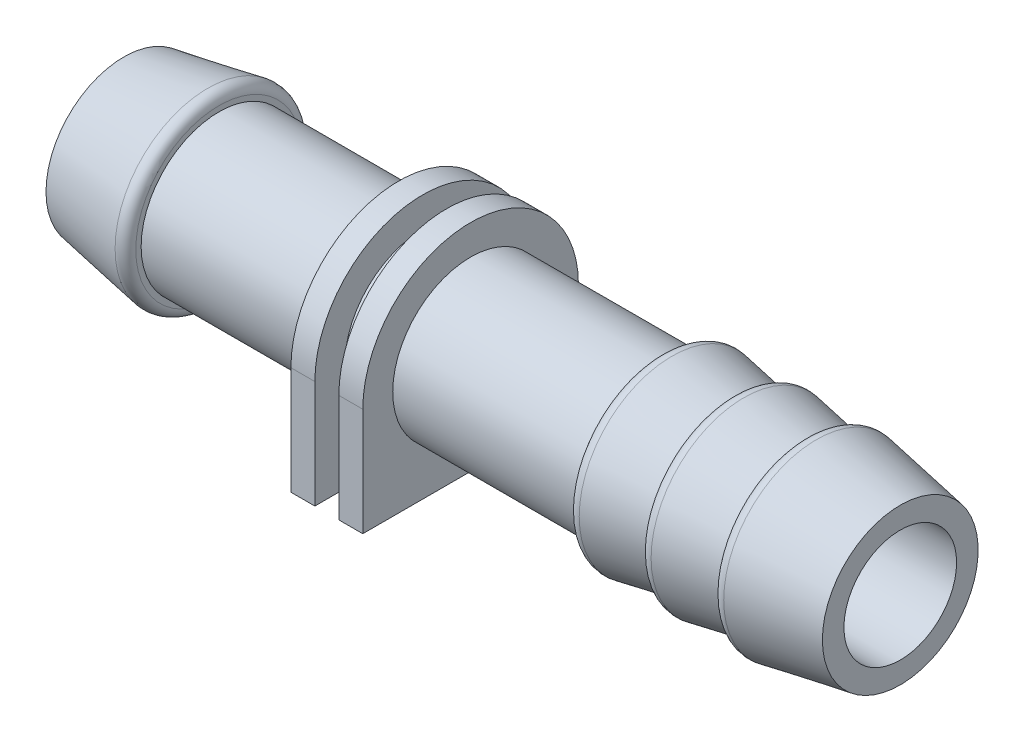
ISO-10303-21;
HEADER;
FILE_DESCRIPTION(('STEP AP214'),'2;1');
FILE_NAME('part.step','',(''),(''),'','','');
FILE_SCHEMA(('AUTOMOTIVE_DESIGN { 1 0 10303 214 1 1 1 1 }'));
ENDSEC;
DATA;
#1=APPLICATION_CONTEXT('core data for automotive mechanical design processes');
#2=APPLICATION_PROTOCOL_DEFINITION('international standard','automotive_design',2000,#1);
#3=PRODUCT_CONTEXT('',#1,'mechanical');
#4=PRODUCT('Part','Part','',(#3));
#5=PRODUCT_RELATED_PRODUCT_CATEGORY('part','',(#4));
#6=PRODUCT_DEFINITION_FORMATION('','',#4);
#7=PRODUCT_DEFINITION_CONTEXT('part definition',#1,'design');
#8=PRODUCT_DEFINITION('design','',#6,#7);
#9=PRODUCT_DEFINITION_SHAPE('','',#8);
#10=(LENGTH_UNIT() NAMED_UNIT(*) SI_UNIT(.MILLI.,.METRE.));
#11=(NAMED_UNIT(*) PLANE_ANGLE_UNIT() SI_UNIT($,.RADIAN.));
#12=(NAMED_UNIT(*) SI_UNIT($,.STERADIAN.) SOLID_ANGLE_UNIT());
#13=UNCERTAINTY_MEASURE_WITH_UNIT(LENGTH_MEASURE(1.E-05),#10,'distance_accuracy_value','');
#14=(GEOMETRIC_REPRESENTATION_CONTEXT(3) GLOBAL_UNCERTAINTY_ASSIGNED_CONTEXT((#13)) GLOBAL_UNIT_ASSIGNED_CONTEXT((#10,
#11,#12)) REPRESENTATION_CONTEXT('',''));
#15=CARTESIAN_POINT('',(0.,0.,0.));
#16=DIRECTION('',(0.,0.,1.));
#17=DIRECTION('',(1.,0.,0.));
#18=AXIS2_PLACEMENT_3D('',#15,#16,#17);
#19=CARTESIAN_POINT('',(9.91718406598036,0.,0.));
#20=DIRECTION('',(-1.,0.,0.));
#21=DIRECTION('',(0.,0.,1.));
#22=AXIS2_PLACEMENT_3D('',#19,#20,#21);
#23=TOROIDAL_SURFACE('',#22,3.47329856296232,0.4);
#24=CARTESIAN_POINT('',(9.98664333704714,0.,0.));
#25=DIRECTION('',(-1.,0.,0.));
#26=DIRECTION('',(0.,0.,1.));
#27=AXIS2_PLACEMENT_3D('',#24,#25,#26);
#28=CIRCLE('',#27,3.8672216641672);
#29=CARTESIAN_POINT('',(9.98664333704714,0.,3.8672216641672));
#30=VERTEX_POINT('',#29);
#31=EDGE_CURVE('E170',#30,#30,#28,.T.);
#32=ORIENTED_EDGE('',*,*,#31,.T.);
#33=EDGE_LOOP('',(#32));
#34=FACE_BOUND('',#33,.T.);
#35=CARTESIAN_POINT('',(9.51718406598036,0.,0.));
#36=DIRECTION('',(-1.,0.,0.));
#37=DIRECTION('',(0.,0.,1.));
#38=AXIS2_PLACEMENT_3D('',#35,#36,#37);
#39=CIRCLE('',#38,3.47329856296232);
#40=CARTESIAN_POINT('',(9.51718406598036,0.,3.47329856296232));
#41=VERTEX_POINT('',#40);
#42=EDGE_CURVE('E209',#41,#41,#39,.T.);
#43=ORIENTED_EDGE('',*,*,#42,.F.);
#44=EDGE_LOOP('',(#43));
#45=FACE_BOUND('',#44,.T.);
#46=ADVANCED_FACE('F32',(#34,#45),#23,.T.);
#47=CARTESIAN_POINT('',(9.51718406598036,0.,3.47329856296232));
#48=DIRECTION('',(-1.,0.,0.));
#49=DIRECTION('',(0.,0.,1.));
#50=AXIS2_PLACEMENT_3D('',#47,#48,#49);
#51=PLANE('',#50);
#52=ORIENTED_EDGE('',*,*,#42,.T.);
#53=EDGE_LOOP('',(#52));
#54=FACE_BOUND('',#53,.T.);
#55=CARTESIAN_POINT('',(9.51718406598036,0.,0.));
#56=DIRECTION('',(-1.,0.,0.));
#57=DIRECTION('',(0.,0.,1.));
#58=AXIS2_PLACEMENT_3D('',#55,#56,#57);
#59=CIRCLE('',#58,3.41571113504077);
#60=CARTESIAN_POINT('',(9.51718406598036,0.,3.41571113504077));
#61=VERTEX_POINT('',#60);
#62=EDGE_CURVE('E206',#61,#61,#59,.T.);
#63=ORIENTED_EDGE('',*,*,#62,.F.);
#64=EDGE_LOOP('',(#63));
#65=FACE_BOUND('',#64,.T.);
#66=ADVANCED_FACE('F248',(#54,#65),#51,.T.);
#67=CARTESIAN_POINT('',(6.9565406107797,0.,0.));
#68=DIRECTION('',(-1.,0.,0.));
#69=DIRECTION('',(0.,0.,1.));
#70=AXIS2_PLACEMENT_3D('',#67,#68,#69);
#71=CONICAL_SURFACE('',#70,3.8672216641672,0.174532925199434);
#72=ORIENTED_EDGE('',*,*,#62,.T.);
#73=EDGE_LOOP('',(#72));
#74=FACE_BOUND('',#73,.T.);
#75=CARTESIAN_POINT('',(6.9565406107797,0.,0.));
#76=DIRECTION('',(-1.,0.,0.));
#77=DIRECTION('',(0.,0.,1.));
#78=AXIS2_PLACEMENT_3D('',#75,#76,#77);
#79=CIRCLE('',#78,3.8672216641672);
#80=CARTESIAN_POINT('',(6.9565406107797,0.,3.8672216641672));
#81=VERTEX_POINT('',#80);
#82=EDGE_CURVE('E203',#81,#81,#79,.T.);
#83=ORIENTED_EDGE('',*,*,#82,.F.);
#84=EDGE_LOOP('',(#83));
#85=FACE_BOUND('',#84,.T.);
#86=ADVANCED_FACE('F253',(#74,#85),#71,.T.);
#87=CARTESIAN_POINT('',(6.88708133971292,0.,0.));
#88=DIRECTION('',(-1.,0.,0.));
#89=DIRECTION('',(0.,0.,1.));
#90=AXIS2_PLACEMENT_3D('',#87,#88,#89);
#91=TOROIDAL_SURFACE('',#90,3.47329856296232,0.4);
#92=ORIENTED_EDGE('',*,*,#82,.T.);
#93=EDGE_LOOP('',(#92));
#94=FACE_BOUND('',#93,.T.);
#95=CARTESIAN_POINT('',(6.48708133971292,0.,0.));
#96=DIRECTION('',(-1.,0.,0.));
#97=DIRECTION('',(0.,0.,1.));
#98=AXIS2_PLACEMENT_3D('',#95,#96,#97);
#99=CIRCLE('',#98,3.47329856296231);
#100=CARTESIAN_POINT('',(6.48708133971292,0.,3.47329856296231));
#101=VERTEX_POINT('',#100);
#102=EDGE_CURVE('E200',#101,#101,#99,.T.);
#103=ORIENTED_EDGE('',*,*,#102,.F.);
#104=EDGE_LOOP('',(#103));
#105=FACE_BOUND('',#104,.T.);
#106=ADVANCED_FACE('F263',(#94,#105),#91,.T.);
#107=CARTESIAN_POINT('',(6.48708133971292,0.,3.47329856296231));
#108=DIRECTION('',(-1.,0.,0.));
#109=DIRECTION('',(0.,0.,1.));
#110=AXIS2_PLACEMENT_3D('',#107,#108,#109);
#111=PLANE('',#110);
#112=ORIENTED_EDGE('',*,*,#102,.T.);
#113=EDGE_LOOP('',(#112));
#114=FACE_BOUND('',#113,.T.);
#115=CARTESIAN_POINT('',(6.48708133971292,0.,0.));
#116=DIRECTION('',(-1.,0.,0.));
#117=DIRECTION('',(0.,0.,1.));
#118=AXIS2_PLACEMENT_3D('',#115,#116,#117);
#119=CIRCLE('',#118,3.4210190578746);
#120=CARTESIAN_POINT('',(6.48708133971292,0.,3.4210190578746));
#121=VERTEX_POINT('',#120);
#122=EDGE_CURVE('E197',#121,#121,#119,.T.);
#123=ORIENTED_EDGE('',*,*,#122,.F.);
#124=EDGE_LOOP('',(#123));
#125=FACE_BOUND('',#124,.T.);
#126=ADVANCED_FACE('F269',(#114,#125),#111,.T.);
#127=CARTESIAN_POINT('',(3.9565406107797,0.,0.));
#128=DIRECTION('',(-1.,0.,0.));
#129=DIRECTION('',(0.,0.,1.));
#130=AXIS2_PLACEMENT_3D('',#127,#128,#129);
#131=CONICAL_SURFACE('',#130,3.8672216641672,0.174532925199434);
#132=ORIENTED_EDGE('',*,*,#122,.T.);
#133=EDGE_LOOP('',(#132));
#134=FACE_BOUND('',#133,.T.);
#135=CARTESIAN_POINT('',(3.9565406107797,0.,0.));
#136=DIRECTION('',(-1.,0.,0.));
#137=DIRECTION('',(0.,0.,1.));
#138=AXIS2_PLACEMENT_3D('',#135,#136,#137);
#139=CIRCLE('',#138,3.8672216641672);
#140=CARTESIAN_POINT('',(3.9565406107797,0.,3.8672216641672));
#141=VERTEX_POINT('',#140);
#142=EDGE_CURVE('E194',#141,#141,#139,.T.);
#143=ORIENTED_EDGE('',*,*,#142,.F.);
#144=EDGE_LOOP('',(#143));
#145=FACE_BOUND('',#144,.T.);
#146=ADVANCED_FACE('F275',(#134,#145),#131,.T.);
#147=CARTESIAN_POINT('',(3.88708133971292,0.,0.));
#148=DIRECTION('',(-1.,0.,0.));
#149=DIRECTION('',(0.,0.,1.));
#150=AXIS2_PLACEMENT_3D('',#147,#148,#149);
#151=TOROIDAL_SURFACE('',#150,3.47329856296232,0.4);
#152=ORIENTED_EDGE('',*,*,#142,.T.);
#153=EDGE_LOOP('',(#152));
#154=FACE_BOUND('',#153,.T.);
#155=CARTESIAN_POINT('',(3.48708133971292,0.,0.));
#156=DIRECTION('',(-1.,0.,0.));
#157=DIRECTION('',(0.,0.,1.));
#158=AXIS2_PLACEMENT_3D('',#155,#156,#157);
#159=CIRCLE('',#158,3.47329856296231);
#160=CARTESIAN_POINT('',(3.48708133971292,0.,3.47329856296231));
#161=VERTEX_POINT('',#160);
#162=EDGE_CURVE('E191',#161,#161,#159,.T.);
#163=ORIENTED_EDGE('',*,*,#162,.F.);
#164=EDGE_LOOP('',(#163));
#165=FACE_BOUND('',#164,.T.);
#166=ADVANCED_FACE('F281',(#154,#165),#151,.T.);
#167=CARTESIAN_POINT('',(3.48708133971292,0.,3.25));
#168=DIRECTION('',(-1.,0.,0.));
#169=DIRECTION('',(0.,0.,1.));
#170=AXIS2_PLACEMENT_3D('',#167,#168,#169);
#171=PLANE('',#170);
#172=ORIENTED_EDGE('',*,*,#162,.T.);
#173=EDGE_LOOP('',(#172));
#174=FACE_BOUND('',#173,.T.);
#175=CARTESIAN_POINT('',(3.48708133971292,0.,0.));
#176=DIRECTION('',(-1.,0.,0.));
#177=DIRECTION('',(0.,0.,1.));
#178=AXIS2_PLACEMENT_3D('',#175,#176,#177);
#179=CIRCLE('',#178,3.25);
#180=CARTESIAN_POINT('',(3.48708133971292,0.,3.25));
#181=VERTEX_POINT('',#180);
#182=EDGE_CURVE('E188',#181,#181,#179,.T.);
#183=ORIENTED_EDGE('',*,*,#182,.F.);
#184=EDGE_LOOP('',(#183));
#185=FACE_BOUND('',#184,.T.);
#186=ADVANCED_FACE('F287',(#174,#185),#171,.T.);
#187=CARTESIAN_POINT('',(-25.4239234449761,0.,0.));
#188=DIRECTION('',(-1.,0.,0.));
#189=DIRECTION('',(0.,0.,1.));
#190=AXIS2_PLACEMENT_3D('',#187,#188,#189);
#191=CYLINDRICAL_SURFACE('',#190,3.25);
#192=CARTESIAN_POINT('',(-4.44302138655469,0.,0.));
#193=DIRECTION('',(1.,0.,0.));
#194=DIRECTION('',(0.,0.,-1.));
#195=AXIS2_PLACEMENT_3D('',#192,#193,#194);
#196=CIRCLE('',#195,3.25);
#197=CARTESIAN_POINT('',(-4.44302138655469,0.,-3.25));
#198=VERTEX_POINT('',#197);
#199=EDGE_CURVE('E11',#198,#198,#196,.F.);
#200=ORIENTED_EDGE('',*,*,#199,.F.);
#201=EDGE_LOOP('',(#200));
#202=FACE_BOUND('',#201,.T.);
#203=ORIENTED_EDGE('',*,*,#182,.T.);
#204=EDGE_LOOP('',(#203));
#205=FACE_BOUND('',#204,.T.);
#206=ADVANCED_FACE('F235',(#202,#205),#191,.T.);
#207=CARTESIAN_POINT('',(13.4870813397129,0.,3.25));
#208=DIRECTION('',(1.,0.,0.));
#209=DIRECTION('',(0.,0.,-1.));
#210=AXIS2_PLACEMENT_3D('',#207,#208,#209);
#211=PLANE('',#210);
#212=CARTESIAN_POINT('',(13.4870813397129,0.,0.));
#213=DIRECTION('',(1.,0.,0.));
#214=DIRECTION('',(0.,0.,-1.));
#215=AXIS2_PLACEMENT_3D('',#212,#213,#214);
#216=CIRCLE('',#215,2.35);
#217=CARTESIAN_POINT('',(13.4870813397129,0.,-2.35));
#218=VERTEX_POINT('',#217);
#219=EDGE_CURVE('E142',#218,#218,#216,.T.);
#220=ORIENTED_EDGE('',*,*,#219,.F.);
#221=EDGE_LOOP('',(#220));
#222=FACE_BOUND('',#221,.T.);
#223=CARTESIAN_POINT('',(13.4870813397129,0.,0.));
#224=DIRECTION('',(-1.,0.,0.));
#225=DIRECTION('',(0.,0.,1.));
#226=AXIS2_PLACEMENT_3D('',#223,#224,#225);
#227=CIRCLE('',#226,3.25);
#228=CARTESIAN_POINT('',(13.4870813397129,0.,3.25));
#229=VERTEX_POINT('',#228);
#230=EDGE_CURVE('E173',#229,#229,#227,.T.);
#231=ORIENTED_EDGE('',*,*,#230,.F.);
#232=EDGE_LOOP('',(#231));
#233=FACE_BOUND('',#232,.T.);
#234=ADVANCED_FACE('F297',(#222,#233),#211,.T.);
#235=CARTESIAN_POINT('',(9.98664333704714,0.,0.));
#236=DIRECTION('',(-1.,0.,0.));
#237=DIRECTION('',(0.,0.,1.));
#238=AXIS2_PLACEMENT_3D('',#235,#236,#237);
#239=CONICAL_SURFACE('',#238,3.8672216641672,0.174532925199426);
#240=ORIENTED_EDGE('',*,*,#230,.T.);
#241=EDGE_LOOP('',(#240));
#242=FACE_BOUND('',#241,.T.);
#243=ORIENTED_EDGE('',*,*,#31,.F.);
#244=EDGE_LOOP('',(#243));
#245=FACE_BOUND('',#244,.T.);
#246=ADVANCED_FACE('F245',(#242,#245),#239,.T.);
#247=CARTESIAN_POINT('',(-25.5597224034406,0.,0.));
#248=DIRECTION('',(1.,0.,0.));
#249=DIRECTION('',(0.,0.,-1.));
#250=AXIS2_PLACEMENT_3D('',#247,#248,#249);
#251=CYLINDRICAL_SURFACE('',#250,2.35);
#252=CARTESIAN_POINT('',(-4.44302138655469,0.,0.));
#253=DIRECTION('',(1.,0.,0.));
#254=DIRECTION('',(0.,0.,-1.));
#255=AXIS2_PLACEMENT_3D('',#252,#253,#254);
#256=CIRCLE('',#255,2.35);
#257=CARTESIAN_POINT('',(-4.44302138655469,0.,-2.35));
#258=VERTEX_POINT('',#257);
#259=EDGE_CURVE('E35',#258,#258,#256,.F.);
#260=ORIENTED_EDGE('',*,*,#259,.T.);
#261=EDGE_LOOP('',(#260));
#262=FACE_BOUND('',#261,.T.);
#263=ORIENTED_EDGE('',*,*,#219,.T.);
#264=EDGE_LOOP('',(#263));
#265=FACE_BOUND('',#264,.T.);
#266=ADVANCED_FACE('F227',(#262,#265),#251,.F.);
#267=CARTESIAN_POINT('',(-4.44302138655469,0.,0.));
#268=DIRECTION('',(1.,0.,0.));
#269=DIRECTION('',(0.,0.,-1.));
#270=AXIS2_PLACEMENT_3D('',#267,#268,#269);
#271=PLANE('',#270);
#272=ORIENTED_EDGE('',*,*,#259,.F.);
#273=EDGE_LOOP('',(#272));
#274=FACE_BOUND('',#273,.T.);
#275=ADVANCED_FACE('F244',(#274),#271,.T.);
#276=CARTESIAN_POINT('',(-4.44302138655469,-4.5,4.5));
#277=DIRECTION('',(0.,0.,-1.));
#278=DIRECTION('',(-1.,0.,0.));
#279=AXIS2_PLACEMENT_3D('',#276,#277,#278);
#280=PLANE('',#279);
#281=DIRECTION('',(0.,-1.,0.));
#282=VECTOR('',#281,1.);
#283=CARTESIAN_POINT('',(-5.44302138655469,-4.5,4.5));
#284=LINE('',#283,#282);
#285=CARTESIAN_POINT('',(-5.44302138655469,0.,4.5));
#286=VERTEX_POINT('',#285);
#287=CARTESIAN_POINT('',(-5.44302138655469,-4.5,4.5));
#288=VERTEX_POINT('',#287);
#289=EDGE_CURVE('E133',#286,#288,#284,.T.);
#290=ORIENTED_EDGE('',*,*,#289,.T.);
#291=DIRECTION('',(-1.,0.,0.));
#292=VECTOR('',#291,1.);
#293=CARTESIAN_POINT('',(-4.44302138655469,-4.5,4.5));
#294=LINE('',#293,#292);
#295=CARTESIAN_POINT('',(-4.44302138655469,-4.5,4.5));
#296=VERTEX_POINT('',#295);
#297=EDGE_CURVE('E113',#296,#288,#294,.T.);
#298=ORIENTED_EDGE('',*,*,#297,.F.);
#299=DIRECTION('',(0.,-1.,0.));
#300=VECTOR('',#299,1.);
#301=CARTESIAN_POINT('',(-4.44302138655469,-4.5,4.5));
#302=LINE('',#301,#300);
#303=CARTESIAN_POINT('',(-4.44302138655469,0.,4.5));
#304=VERTEX_POINT('',#303);
#305=EDGE_CURVE('E120',#304,#296,#302,.T.);
#306=ORIENTED_EDGE('',*,*,#305,.F.);
#307=DIRECTION('',(-1.,0.,0.));
#308=VECTOR('',#307,1.);
#309=CARTESIAN_POINT('',(-4.44302138655469,0.,4.5));
#310=LINE('',#309,#308);
#311=EDGE_CURVE('E335',#304,#286,#310,.T.);
#312=ORIENTED_EDGE('',*,*,#311,.T.);
#313=EDGE_LOOP('',(#290,#298,#306,#312));
#314=FACE_BOUND('',#313,.T.);
#315=ADVANCED_FACE('F131',(#314),#280,.F.);
#316=CARTESIAN_POINT('',(-4.44302138655469,-4.5,-4.5));
#317=DIRECTION('',(0.,1.,0.));
#318=DIRECTION('',(0.,0.,1.));
#319=AXIS2_PLACEMENT_3D('',#316,#317,#318);
#320=PLANE('',#319);
#321=DIRECTION('',(0.,0.,-1.));
#322=VECTOR('',#321,1.);
#323=CARTESIAN_POINT('',(-5.44302138655469,-4.5,-4.5));
#324=LINE('',#323,#322);
#325=CARTESIAN_POINT('',(-5.44302138655469,-4.5,-4.5));
#326=VERTEX_POINT('',#325);
#327=EDGE_CURVE('E326',#288,#326,#324,.T.);
#328=ORIENTED_EDGE('',*,*,#327,.T.);
#329=DIRECTION('',(-1.,0.,0.));
#330=VECTOR('',#329,1.);
#331=CARTESIAN_POINT('',(-4.44302138655469,-4.5,-4.5));
#332=LINE('',#331,#330);
#333=CARTESIAN_POINT('',(-4.44302138655469,-4.5,-4.5));
#334=VERTEX_POINT('',#333);
#335=EDGE_CURVE('E116',#334,#326,#332,.T.);
#336=ORIENTED_EDGE('',*,*,#335,.F.);
#337=DIRECTION('',(0.,0.,-1.));
#338=VECTOR('',#337,1.);
#339=CARTESIAN_POINT('',(-4.44302138655469,-4.5,-4.5));
#340=LINE('',#339,#338);
#341=EDGE_CURVE('E109',#296,#334,#340,.T.);
#342=ORIENTED_EDGE('',*,*,#341,.F.);
#343=ORIENTED_EDGE('',*,*,#297,.T.);
#344=EDGE_LOOP('',(#328,#336,#342,#343));
#345=FACE_BOUND('',#344,.T.);
#346=ADVANCED_FACE('F111',(#345),#320,.F.);
#347=CARTESIAN_POINT('',(-4.44302138655469,0.,-4.5));
#348=DIRECTION('',(0.,0.,1.));
#349=DIRECTION('',(1.,0.,0.));
#350=AXIS2_PLACEMENT_3D('',#347,#348,#349);
#351=PLANE('',#350);
#352=DIRECTION('',(0.,1.,0.));
#353=VECTOR('',#352,1.);
#354=CARTESIAN_POINT('',(-5.44302138655469,0.,-4.5));
#355=LINE('',#354,#353);
#356=CARTESIAN_POINT('',(-5.44302138655469,0.,-4.5));
#357=VERTEX_POINT('',#356);
#358=EDGE_CURVE('E328',#326,#357,#355,.T.);
#359=ORIENTED_EDGE('',*,*,#358,.T.);
#360=DIRECTION('',(-1.,0.,0.));
#361=VECTOR('',#360,1.);
#362=CARTESIAN_POINT('',(-4.44302138655469,0.,-4.5));
#363=LINE('',#362,#361);
#364=CARTESIAN_POINT('',(-4.44302138655469,0.,-4.5));
#365=VERTEX_POINT('',#364);
#366=EDGE_CURVE('E138',#365,#357,#363,.T.);
#367=ORIENTED_EDGE('',*,*,#366,.F.);
#368=DIRECTION('',(0.,1.,0.));
#369=VECTOR('',#368,1.);
#370=CARTESIAN_POINT('',(-4.44302138655469,0.,-4.5));
#371=LINE('',#370,#369);
#372=EDGE_CURVE('E119',#334,#365,#371,.T.);
#373=ORIENTED_EDGE('',*,*,#372,.F.);
#374=ORIENTED_EDGE('',*,*,#335,.T.);
#375=EDGE_LOOP('',(#359,#367,#373,#374));
#376=FACE_BOUND('',#375,.T.);
#377=ADVANCED_FACE('F341',(#376),#351,.F.);
#378=CARTESIAN_POINT('',(-4.44302138655469,0.,0.));
#379=DIRECTION('',(-1.,0.,0.));
#380=DIRECTION('',(0.,0.,1.));
#381=AXIS2_PLACEMENT_3D('',#378,#379,#380);
#382=CYLINDRICAL_SURFACE('',#381,4.5);
#383=CARTESIAN_POINT('',(-5.44302138655469,0.,0.));
#384=DIRECTION('',(1.,0.,0.));
#385=DIRECTION('',(0.,0.,-1.));
#386=AXIS2_PLACEMENT_3D('',#383,#384,#385);
#387=CIRCLE('',#386,4.5);
#388=EDGE_CURVE('E129',#357,#286,#387,.T.);
#389=ORIENTED_EDGE('',*,*,#388,.T.);
#390=ORIENTED_EDGE('',*,*,#311,.F.);
#391=CARTESIAN_POINT('',(-4.44302138655469,0.,0.));
#392=DIRECTION('',(1.,0.,0.));
#393=DIRECTION('',(0.,0.,-1.));
#394=AXIS2_PLACEMENT_3D('',#391,#392,#393);
#395=CIRCLE('',#394,4.5);
#396=EDGE_CURVE('E125',#365,#304,#395,.T.);
#397=ORIENTED_EDGE('',*,*,#396,.F.);
#398=ORIENTED_EDGE('',*,*,#366,.T.);
#399=EDGE_LOOP('',(#389,#390,#397,#398));
#400=FACE_BOUND('',#399,.T.);
#401=ADVANCED_FACE('F339',(#400),#382,.T.);
#402=ORIENTED_EDGE('',*,*,#199,.T.);
#403=EDGE_LOOP('',(#402));
#404=FACE_BOUND('',#403,.T.);
#405=ORIENTED_EDGE('',*,*,#305,.T.);
#406=ORIENTED_EDGE('',*,*,#341,.T.);
#407=ORIENTED_EDGE('',*,*,#372,.T.);
#408=ORIENTED_EDGE('',*,*,#396,.T.);
#409=EDGE_LOOP('',(#405,#406,#407,#408));
#410=FACE_BOUND('',#409,.T.);
#411=ADVANCED_FACE('F123',(#404,#410),#271,.T.);
#412=CARTESIAN_POINT('',(-5.44302138655469,0.,0.));
#413=DIRECTION('',(1.,0.,0.));
#414=DIRECTION('',(0.,0.,-1.));
#415=AXIS2_PLACEMENT_3D('',#412,#413,#414);
#416=PLANE('',#415);
#417=CARTESIAN_POINT('',(-5.44302138655469,0.,0.));
#418=DIRECTION('',(1.,0.,0.));
#419=DIRECTION('',(0.,0.,-1.));
#420=AXIS2_PLACEMENT_3D('',#417,#418,#419);
#421=CIRCLE('',#420,3.25);
#422=CARTESIAN_POINT('',(-5.44302138655469,0.,-3.25));
#423=VERTEX_POINT('',#422);
#424=EDGE_CURVE('E134',#423,#423,#421,.F.);
#425=ORIENTED_EDGE('',*,*,#424,.F.);
#426=EDGE_LOOP('',(#425));
#427=FACE_BOUND('',#426,.T.);
#428=ORIENTED_EDGE('',*,*,#289,.F.);
#429=ORIENTED_EDGE('',*,*,#388,.F.);
#430=ORIENTED_EDGE('',*,*,#358,.F.);
#431=ORIENTED_EDGE('',*,*,#327,.F.);
#432=EDGE_LOOP('',(#428,#429,#430,#431));
#433=FACE_BOUND('',#432,.T.);
#434=ADVANCED_FACE('F314',(#427,#433),#416,.F.);
#435=CARTESIAN_POINT('',(-14.9430213865547,0.,3.47329856296231));
#436=DIRECTION('',(1.,0.,0.));
#437=DIRECTION('',(0.,0.,-1.));
#438=AXIS2_PLACEMENT_3D('',#435,#436,#437);
#439=PLANE('',#438);
#440=CARTESIAN_POINT('',(-14.9430213865547,0.,0.));
#441=DIRECTION('',(-1.,0.,0.));
#442=DIRECTION('',(0.,0.,1.));
#443=AXIS2_PLACEMENT_3D('',#440,#441,#442);
#444=CIRCLE('',#443,3.25);
#445=CARTESIAN_POINT('',(-14.9430213865547,0.,3.25));
#446=VERTEX_POINT('',#445);
#447=EDGE_CURVE('E185',#446,#446,#444,.T.);
#448=ORIENTED_EDGE('',*,*,#447,.T.);
#449=EDGE_LOOP('',(#448));
#450=FACE_BOUND('',#449,.T.);
#451=CARTESIAN_POINT('',(-14.9430213865547,0.,0.));
#452=DIRECTION('',(-1.,0.,0.));
#453=DIRECTION('',(0.,0.,1.));
#454=AXIS2_PLACEMENT_3D('',#451,#452,#453);
#455=CIRCLE('',#454,3.47329856296231);
#456=CARTESIAN_POINT('',(-14.9430213865547,0.,3.47329856296231));
#457=VERTEX_POINT('',#456);
#458=EDGE_CURVE('E182',#457,#457,#455,.T.);
#459=ORIENTED_EDGE('',*,*,#458,.F.);
#460=EDGE_LOOP('',(#459));
#461=FACE_BOUND('',#460,.T.);
#462=ADVANCED_FACE('F323',(#450,#461),#439,.T.);
#463=CARTESIAN_POINT('',(-15.3430213865547,0.,0.));
#464=DIRECTION('',(-1.,0.,0.));
#465=DIRECTION('',(0.,0.,1.));
#466=AXIS2_PLACEMENT_3D('',#463,#464,#465);
#467=TOROIDAL_SURFACE('',#466,3.47329856296232,0.4);
#468=ORIENTED_EDGE('',*,*,#458,.T.);
#469=EDGE_LOOP('',(#468));
#470=FACE_BOUND('',#469,.T.);
#471=CARTESIAN_POINT('',(-15.4124806576215,0.,0.));
#472=DIRECTION('',(-1.,0.,0.));
#473=DIRECTION('',(0.,0.,1.));
#474=AXIS2_PLACEMENT_3D('',#471,#472,#473);
#475=CIRCLE('',#474,3.8672216641672);
#476=CARTESIAN_POINT('',(-15.4124806576215,0.,3.8672216641672));
#477=VERTEX_POINT('',#476);
#478=EDGE_CURVE('E179',#477,#477,#475,.T.);
#479=ORIENTED_EDGE('',*,*,#478,.F.);
#480=EDGE_LOOP('',(#479));
#481=FACE_BOUND('',#480,.T.);
#482=ADVANCED_FACE('F375',(#470,#481),#467,.T.);
#483=CARTESIAN_POINT('',(-18.9129186602871,0.,0.));
#484=DIRECTION('',(1.,0.,0.));
#485=DIRECTION('',(0.,0.,-1.));
#486=AXIS2_PLACEMENT_3D('',#483,#484,#485);
#487=CONICAL_SURFACE('',#486,3.25,0.174532925199433);
#488=ORIENTED_EDGE('',*,*,#478,.T.);
#489=EDGE_LOOP('',(#488));
#490=FACE_BOUND('',#489,.T.);
#491=CARTESIAN_POINT('',(-18.9129186602871,0.,0.));
#492=DIRECTION('',(-1.,0.,0.));
#493=DIRECTION('',(0.,0.,1.));
#494=AXIS2_PLACEMENT_3D('',#491,#492,#493);
#495=CIRCLE('',#494,3.25);
#496=CARTESIAN_POINT('',(-18.9129186602871,0.,3.25));
#497=VERTEX_POINT('',#496);
#498=EDGE_CURVE('E176',#497,#497,#495,.T.);
#499=ORIENTED_EDGE('',*,*,#498,.F.);
#500=EDGE_LOOP('',(#499));
#501=FACE_BOUND('',#500,.T.);
#502=ADVANCED_FACE('F237',(#490,#501),#487,.T.);
#503=CARTESIAN_POINT('',(-18.9129186602871,0.,3.25));
#504=DIRECTION('',(-1.,0.,0.));
#505=DIRECTION('',(0.,0.,1.));
#506=AXIS2_PLACEMENT_3D('',#503,#504,#505);
#507=PLANE('',#506);
#508=CARTESIAN_POINT('',(-18.9129186602871,0.,0.));
#509=DIRECTION('',(-1.,0.,0.));
#510=DIRECTION('',(0.,0.,1.));
#511=AXIS2_PLACEMENT_3D('',#508,#509,#510);
#512=CIRCLE('',#511,2.35);
#513=CARTESIAN_POINT('',(-18.9129186602871,0.,2.35));
#514=VERTEX_POINT('',#513);
#515=EDGE_CURVE('E145',#514,#514,#512,.F.);
#516=ORIENTED_EDGE('',*,*,#515,.T.);
#517=EDGE_LOOP('',(#516));
#518=FACE_BOUND('',#517,.T.);
#519=ORIENTED_EDGE('',*,*,#498,.T.);
#520=EDGE_LOOP('',(#519));
#521=FACE_BOUND('',#520,.T.);
#522=ADVANCED_FACE('F224',(#518,#521),#507,.T.);
#523=ORIENTED_EDGE('',*,*,#515,.F.);
#524=EDGE_LOOP('',(#523));
#525=FACE_BOUND('',#524,.T.);
#526=CARTESIAN_POINT('',(-5.44302138655469,0.,0.));
#527=DIRECTION('',(1.,0.,0.));
#528=DIRECTION('',(0.,0.,-1.));
#529=AXIS2_PLACEMENT_3D('',#526,#527,#528);
#530=CIRCLE('',#529,2.35);
#531=CARTESIAN_POINT('',(-5.44302138655469,0.,-2.35));
#532=VERTEX_POINT('',#531);
#533=EDGE_CURVE('E41',#532,#532,#530,.F.);
#534=ORIENTED_EDGE('',*,*,#533,.F.);
#535=EDGE_LOOP('',(#534));
#536=FACE_BOUND('',#535,.T.);
#537=ADVANCED_FACE('F221',(#525,#536),#251,.F.);
#538=ORIENTED_EDGE('',*,*,#447,.F.);
#539=EDGE_LOOP('',(#538));
#540=FACE_BOUND('',#539,.T.);
#541=CARTESIAN_POINT('',(-7.44302138655469,0.,0.));
#542=DIRECTION('',(1.,0.,0.));
#543=DIRECTION('',(0.,0.,-1.));
#544=AXIS2_PLACEMENT_3D('',#541,#542,#543);
#545=CIRCLE('',#544,3.25);
#546=CARTESIAN_POINT('',(-7.44302138655469,0.,-3.25));
#547=VERTEX_POINT('',#546);
#548=EDGE_CURVE('E169',#547,#547,#545,.F.);
#549=ORIENTED_EDGE('',*,*,#548,.T.);
#550=EDGE_LOOP('',(#549));
#551=FACE_BOUND('',#550,.T.);
#552=ADVANCED_FACE('F223',(#540,#551),#191,.T.);
#553=CARTESIAN_POINT('',(-7.44302138655469,0.,0.));
#554=DIRECTION('',(1.,0.,0.));
#555=DIRECTION('',(0.,0.,-1.));
#556=AXIS2_PLACEMENT_3D('',#553,#554,#555);
#557=PLANE('',#556);
#558=ORIENTED_EDGE('',*,*,#548,.F.);
#559=EDGE_LOOP('',(#558));
#560=FACE_BOUND('',#559,.T.);
#561=DIRECTION('',(0.,-1.,0.));
#562=VECTOR('',#561,1.);
#563=CARTESIAN_POINT('',(-7.44302138655469,-4.5,4.5));
#564=LINE('',#563,#562);
#565=CARTESIAN_POINT('',(-7.44302138655469,0.,4.5));
#566=VERTEX_POINT('',#565);
#567=CARTESIAN_POINT('',(-7.44302138655469,-4.5,4.5));
#568=VERTEX_POINT('',#567);
#569=EDGE_CURVE('E148',#566,#568,#564,.T.);
#570=ORIENTED_EDGE('',*,*,#569,.F.);
#571=CARTESIAN_POINT('',(-7.44302138655469,0.,0.));
#572=DIRECTION('',(1.,0.,0.));
#573=DIRECTION('',(0.,0.,-1.));
#574=AXIS2_PLACEMENT_3D('',#571,#572,#573);
#575=CIRCLE('',#574,4.5);
#576=CARTESIAN_POINT('',(-7.44302138655469,0.,-4.5));
#577=VERTEX_POINT('',#576);
#578=EDGE_CURVE('E74',#577,#566,#575,.T.);
#579=ORIENTED_EDGE('',*,*,#578,.F.);
#580=DIRECTION('',(0.,1.,0.));
#581=VECTOR('',#580,1.);
#582=CARTESIAN_POINT('',(-7.44302138655469,0.,-4.5));
#583=LINE('',#582,#581);
#584=CARTESIAN_POINT('',(-7.44302138655469,-4.5,-4.5));
#585=VERTEX_POINT('',#584);
#586=EDGE_CURVE('E68',#585,#577,#583,.T.);
#587=ORIENTED_EDGE('',*,*,#586,.F.);
#588=DIRECTION('',(0.,0.,-1.));
#589=VECTOR('',#588,1.);
#590=CARTESIAN_POINT('',(-7.44302138655469,-4.5,-4.5));
#591=LINE('',#590,#589);
#592=EDGE_CURVE('E158',#568,#585,#591,.T.);
#593=ORIENTED_EDGE('',*,*,#592,.F.);
#594=EDGE_LOOP('',(#570,#579,#587,#593));
#595=FACE_BOUND('',#594,.T.);
#596=ADVANCED_FACE('F232',(#560,#595),#557,.F.);
#597=CARTESIAN_POINT('',(-6.44302138655469,0.,0.));
#598=DIRECTION('',(-1.,0.,0.));
#599=DIRECTION('',(0.,0.,1.));
#600=AXIS2_PLACEMENT_3D('',#597,#598,#599);
#601=CYLINDRICAL_SURFACE('',#600,4.5);
#602=ORIENTED_EDGE('',*,*,#578,.T.);
#603=DIRECTION('',(-1.,0.,0.));
#604=VECTOR('',#603,1.);
#605=CARTESIAN_POINT('',(-6.44302138655469,0.,4.5));
#606=LINE('',#605,#604);
#607=CARTESIAN_POINT('',(-6.44302138655469,0.,4.5));
#608=VERTEX_POINT('',#607);
#609=EDGE_CURVE('E155',#608,#566,#606,.T.);
#610=ORIENTED_EDGE('',*,*,#609,.F.);
#611=CARTESIAN_POINT('',(-6.44302138655469,0.,0.));
#612=DIRECTION('',(1.,0.,0.));
#613=DIRECTION('',(0.,0.,-1.));
#614=AXIS2_PLACEMENT_3D('',#611,#612,#613);
#615=CIRCLE('',#614,4.5);
#616=CARTESIAN_POINT('',(-6.44302138655469,0.,-4.5));
#617=VERTEX_POINT('',#616);
#618=EDGE_CURVE('E50',#617,#608,#615,.T.);
#619=ORIENTED_EDGE('',*,*,#618,.F.);
#620=DIRECTION('',(-1.,0.,0.));
#621=VECTOR('',#620,1.);
#622=CARTESIAN_POINT('',(-6.44302138655469,0.,-4.5));
#623=LINE('',#622,#621);
#624=EDGE_CURVE('E163',#617,#577,#623,.T.);
#625=ORIENTED_EDGE('',*,*,#624,.T.);
#626=EDGE_LOOP('',(#602,#610,#619,#625));
#627=FACE_BOUND('',#626,.T.);
#628=ADVANCED_FACE('F490',(#627),#601,.T.);
#629=CARTESIAN_POINT('',(-6.44302138655469,0.,-4.5));
#630=DIRECTION('',(0.,0.,1.));
#631=DIRECTION('',(1.,0.,0.));
#632=AXIS2_PLACEMENT_3D('',#629,#630,#631);
#633=PLANE('',#632);
#634=ORIENTED_EDGE('',*,*,#586,.T.);
#635=ORIENTED_EDGE('',*,*,#624,.F.);
#636=DIRECTION('',(0.,1.,0.));
#637=VECTOR('',#636,1.);
#638=CARTESIAN_POINT('',(-6.44302138655469,0.,-4.5));
#639=LINE('',#638,#637);
#640=CARTESIAN_POINT('',(-6.44302138655469,-4.5,-4.5));
#641=VERTEX_POINT('',#640);
#642=EDGE_CURVE('E152',#641,#617,#639,.T.);
#643=ORIENTED_EDGE('',*,*,#642,.F.);
#644=DIRECTION('',(-1.,0.,0.));
#645=VECTOR('',#644,1.);
#646=CARTESIAN_POINT('',(-6.44302138655469,-4.5,-4.5));
#647=LINE('',#646,#645);
#648=EDGE_CURVE('E165',#641,#585,#647,.T.);
#649=ORIENTED_EDGE('',*,*,#648,.T.);
#650=EDGE_LOOP('',(#634,#635,#643,#649));
#651=FACE_BOUND('',#650,.T.);
#652=ADVANCED_FACE('F481',(#651),#633,.F.);
#653=CARTESIAN_POINT('',(-6.44302138655469,-4.5,-4.5));
#654=DIRECTION('',(0.,1.,0.));
#655=DIRECTION('',(0.,0.,1.));
#656=AXIS2_PLACEMENT_3D('',#653,#654,#655);
#657=PLANE('',#656);
#658=ORIENTED_EDGE('',*,*,#592,.T.);
#659=ORIENTED_EDGE('',*,*,#648,.F.);
#660=DIRECTION('',(0.,0.,-1.));
#661=VECTOR('',#660,1.);
#662=CARTESIAN_POINT('',(-6.44302138655469,-4.5,-4.5));
#663=LINE('',#662,#661);
#664=CARTESIAN_POINT('',(-6.44302138655469,-4.5,4.5));
#665=VERTEX_POINT('',#664);
#666=EDGE_CURVE('E82',#665,#641,#663,.T.);
#667=ORIENTED_EDGE('',*,*,#666,.F.);
#668=DIRECTION('',(-1.,0.,0.));
#669=VECTOR('',#668,1.);
#670=CARTESIAN_POINT('',(-6.44302138655469,-4.5,4.5));
#671=LINE('',#670,#669);
#672=EDGE_CURVE('E167',#665,#568,#671,.T.);
#673=ORIENTED_EDGE('',*,*,#672,.T.);
#674=EDGE_LOOP('',(#658,#659,#667,#673));
#675=FACE_BOUND('',#674,.T.);
#676=ADVANCED_FACE('F471',(#675),#657,.F.);
#677=CARTESIAN_POINT('',(-6.44302138655469,-4.5,4.5));
#678=DIRECTION('',(0.,0.,-1.));
#679=DIRECTION('',(-1.,0.,0.));
#680=AXIS2_PLACEMENT_3D('',#677,#678,#679);
#681=PLANE('',#680);
#682=ORIENTED_EDGE('',*,*,#569,.T.);
#683=ORIENTED_EDGE('',*,*,#672,.F.);
#684=DIRECTION('',(0.,-1.,0.));
#685=VECTOR('',#684,1.);
#686=CARTESIAN_POINT('',(-6.44302138655469,-4.5,4.5));
#687=LINE('',#686,#685);
#688=EDGE_CURVE('E149',#608,#665,#687,.T.);
#689=ORIENTED_EDGE('',*,*,#688,.F.);
#690=ORIENTED_EDGE('',*,*,#609,.T.);
#691=EDGE_LOOP('',(#682,#683,#689,#690));
#692=FACE_BOUND('',#691,.T.);
#693=ADVANCED_FACE('F315',(#692),#681,.F.);
#694=CARTESIAN_POINT('',(-6.44302138655469,0.,0.));
#695=DIRECTION('',(1.,0.,0.));
#696=DIRECTION('',(0.,0.,-1.));
#697=AXIS2_PLACEMENT_3D('',#694,#695,#696);
#698=PLANE('',#697);
#699=CARTESIAN_POINT('',(-6.44302138655469,0.,0.));
#700=DIRECTION('',(1.,0.,0.));
#701=DIRECTION('',(0.,0.,-1.));
#702=AXIS2_PLACEMENT_3D('',#699,#700,#701);
#703=CIRCLE('',#702,3.25);
#704=CARTESIAN_POINT('',(-6.44302138655469,0.,-3.25));
#705=VERTEX_POINT('',#704);
#706=EDGE_CURVE('E212',#705,#705,#703,.F.);
#707=ORIENTED_EDGE('',*,*,#706,.T.);
#708=EDGE_LOOP('',(#707));
#709=FACE_BOUND('',#708,.T.);
#710=ORIENTED_EDGE('',*,*,#688,.T.);
#711=ORIENTED_EDGE('',*,*,#666,.T.);
#712=ORIENTED_EDGE('',*,*,#642,.T.);
#713=ORIENTED_EDGE('',*,*,#618,.T.);
#714=EDGE_LOOP('',(#710,#711,#712,#713));
#715=FACE_BOUND('',#714,.T.);
#716=ADVANCED_FACE('F307',(#709,#715),#698,.T.);
#717=ORIENTED_EDGE('',*,*,#706,.F.);
#718=EDGE_LOOP('',(#717));
#719=FACE_BOUND('',#718,.T.);
#720=ORIENTED_EDGE('',*,*,#424,.T.);
#721=EDGE_LOOP('',(#720));
#722=FACE_BOUND('',#721,.T.);
#723=ADVANCED_FACE('F236',(#719,#722),#191,.T.);
#724=ORIENTED_EDGE('',*,*,#533,.T.);
#725=EDGE_LOOP('',(#724));
#726=FACE_BOUND('',#725,.T.);
#727=ADVANCED_FACE('F219',(#726),#416,.F.);
#728=CLOSED_SHELL('',(#46,#66,#86,#106,#126,#146,#166,#186,#206,#234,#246,#266,#275,#315,#346,
#377,#401,#411,#434,#462,#482,#502,#522,#537,#552,#596,#628,#652,#676,#693,#716,#723,#727));
#729=MANIFOLD_SOLID_BREP('B2',#728);
#730=ADVANCED_BREP_SHAPE_REPRESENTATION('',(#18,#729),#14);
#731=SHAPE_DEFINITION_REPRESENTATION(#9,#730);
ENDSEC;
END-ISO-10303-21;
